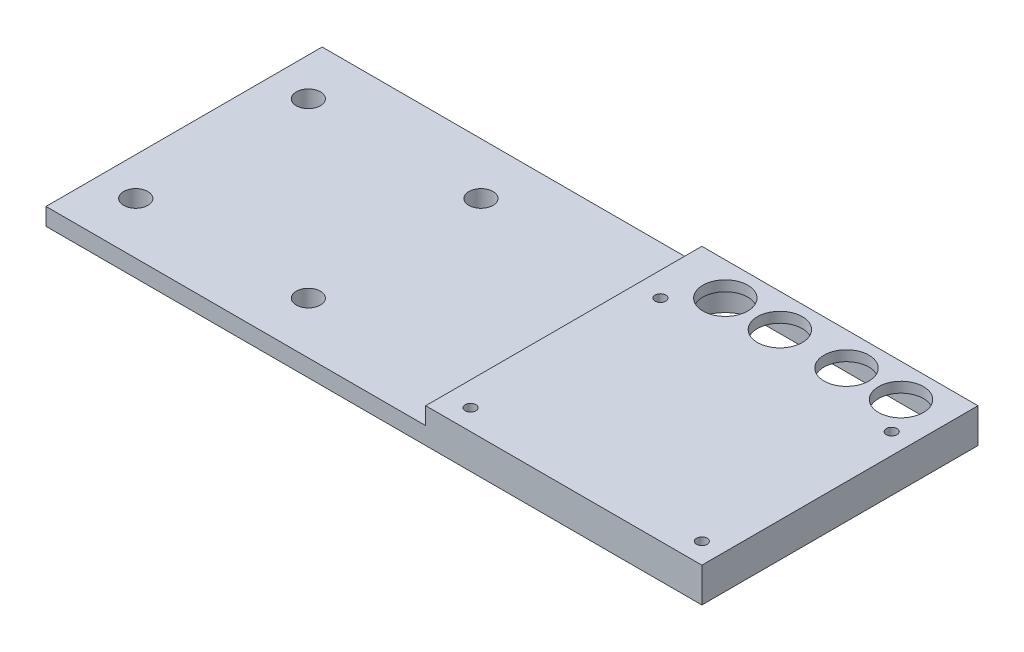
ISO-10303-21;
HEADER;
FILE_DESCRIPTION(('STEP AP214'),'2;1');
FILE_NAME('part.step','',(''),(''),'','','');
FILE_SCHEMA(('AUTOMOTIVE_DESIGN { 1 0 10303 214 1 1 1 1 }'));
ENDSEC;
DATA;
#1=APPLICATION_CONTEXT('core data for automotive mechanical design processes');
#2=APPLICATION_PROTOCOL_DEFINITION('international standard','automotive_design',2000,#1);
#3=PRODUCT_CONTEXT('',#1,'mechanical');
#4=PRODUCT('Part','Part','',(#3));
#5=PRODUCT_RELATED_PRODUCT_CATEGORY('part','',(#4));
#6=PRODUCT_DEFINITION_FORMATION('','',#4);
#7=PRODUCT_DEFINITION_CONTEXT('part definition',#1,'design');
#8=PRODUCT_DEFINITION('design','',#6,#7);
#9=PRODUCT_DEFINITION_SHAPE('','',#8);
#10=(LENGTH_UNIT() NAMED_UNIT(*) SI_UNIT(.MILLI.,.METRE.));
#11=(NAMED_UNIT(*) PLANE_ANGLE_UNIT() SI_UNIT($,.RADIAN.));
#12=(NAMED_UNIT(*) SI_UNIT($,.STERADIAN.) SOLID_ANGLE_UNIT());
#13=UNCERTAINTY_MEASURE_WITH_UNIT(LENGTH_MEASURE(1.E-05),#10,'distance_accuracy_value','');
#14=(GEOMETRIC_REPRESENTATION_CONTEXT(3) GLOBAL_UNCERTAINTY_ASSIGNED_CONTEXT((#13)) GLOBAL_UNIT_ASSIGNED_CONTEXT((#10,
#11,#12)) REPRESENTATION_CONTEXT('',''));
#15=CARTESIAN_POINT('',(0.,0.,0.));
#16=DIRECTION('',(0.,0.,1.));
#17=DIRECTION('',(1.,0.,0.));
#18=AXIS2_PLACEMENT_3D('',#15,#16,#17);
#19=CARTESIAN_POINT('',(82.3,10.,-30.4));
#20=DIRECTION('',(0.,-1.,0.));
#21=DIRECTION('',(0.,0.,-1.));
#22=AXIS2_PLACEMENT_3D('',#19,#20,#21);
#23=CYLINDRICAL_SURFACE('',#22,6.5);
#24=CARTESIAN_POINT('',(82.3,10.,-30.4));
#25=DIRECTION('',(0.,-1.,0.));
#26=DIRECTION('',(0.,0.,-1.));
#27=AXIS2_PLACEMENT_3D('',#24,#25,#26);
#28=CIRCLE('',#27,6.5);
#29=CARTESIAN_POINT('',(82.3,10.,-36.9));
#30=VERTEX_POINT('',#29);
#31=EDGE_CURVE('E174',#30,#30,#28,.T.);
#32=ORIENTED_EDGE('',*,*,#31,.F.);
#33=EDGE_LOOP('',(#32));
#34=FACE_BOUND('',#33,.T.);
#35=CARTESIAN_POINT('',(82.3,7.,-30.4));
#36=DIRECTION('',(0.,-1.,0.));
#37=DIRECTION('',(0.,0.,-1.));
#38=AXIS2_PLACEMENT_3D('',#35,#36,#37);
#39=CIRCLE('',#38,6.5);
#40=CARTESIAN_POINT('',(82.3,7.,-36.9));
#41=VERTEX_POINT('',#40);
#42=EDGE_CURVE('E170',#41,#41,#39,.F.);
#43=ORIENTED_EDGE('',*,*,#42,.F.);
#44=EDGE_LOOP('',(#43));
#45=FACE_BOUND('',#44,.T.);
#46=ADVANCED_FACE('F40',(#34,#45),#23,.F.);
#47=CARTESIAN_POINT('',(66.4999999999999,10.,-30.4));
#48=DIRECTION('',(0.,-1.,0.));
#49=DIRECTION('',(0.,0.,-1.));
#50=AXIS2_PLACEMENT_3D('',#47,#48,#49);
#51=CYLINDRICAL_SURFACE('',#50,6.5);
#52=CARTESIAN_POINT('',(66.4999999999999,10.,-30.4));
#53=DIRECTION('',(0.,-1.,0.));
#54=DIRECTION('',(0.,0.,-1.));
#55=AXIS2_PLACEMENT_3D('',#52,#53,#54);
#56=CIRCLE('',#55,6.5);
#57=CARTESIAN_POINT('',(66.4999999999999,10.,-36.9));
#58=VERTEX_POINT('',#57);
#59=EDGE_CURVE('E184',#58,#58,#56,.T.);
#60=ORIENTED_EDGE('',*,*,#59,.F.);
#61=EDGE_LOOP('',(#60));
#62=FACE_BOUND('',#61,.T.);
#63=CARTESIAN_POINT('',(66.4999999999999,7.,-30.4));
#64=DIRECTION('',(0.,-1.,0.));
#65=DIRECTION('',(0.,0.,-1.));
#66=AXIS2_PLACEMENT_3D('',#63,#64,#65);
#67=CIRCLE('',#66,6.5);
#68=CARTESIAN_POINT('',(66.4999999999999,7.,-36.9));
#69=VERTEX_POINT('',#68);
#70=EDGE_CURVE('E166',#69,#69,#67,.F.);
#71=ORIENTED_EDGE('',*,*,#70,.F.);
#72=EDGE_LOOP('',(#71));
#73=FACE_BOUND('',#72,.T.);
#74=ADVANCED_FACE('F319',(#62,#73),#51,.F.);
#75=CARTESIAN_POINT('',(47.2,10.,-30.4));
#76=DIRECTION('',(0.,-1.,0.));
#77=DIRECTION('',(0.,0.,-1.));
#78=AXIS2_PLACEMENT_3D('',#75,#76,#77);
#79=CYLINDRICAL_SURFACE('',#78,6.5);
#80=CARTESIAN_POINT('',(47.2,10.,-30.4));
#81=DIRECTION('',(0.,-1.,0.));
#82=DIRECTION('',(0.,0.,-1.));
#83=AXIS2_PLACEMENT_3D('',#80,#81,#82);
#84=CIRCLE('',#83,6.5);
#85=CARTESIAN_POINT('',(47.2,10.,-36.9));
#86=VERTEX_POINT('',#85);
#87=EDGE_CURVE('E180',#86,#86,#84,.T.);
#88=ORIENTED_EDGE('',*,*,#87,.F.);
#89=EDGE_LOOP('',(#88));
#90=FACE_BOUND('',#89,.T.);
#91=CARTESIAN_POINT('',(47.2,7.,-30.4));
#92=DIRECTION('',(0.,-1.,0.));
#93=DIRECTION('',(0.,0.,-1.));
#94=AXIS2_PLACEMENT_3D('',#91,#92,#93);
#95=CIRCLE('',#94,6.5);
#96=CARTESIAN_POINT('',(47.2,7.,-36.9));
#97=VERTEX_POINT('',#96);
#98=EDGE_CURVE('E162',#97,#97,#95,.F.);
#99=ORIENTED_EDGE('',*,*,#98,.F.);
#100=EDGE_LOOP('',(#99));
#101=FACE_BOUND('',#100,.T.);
#102=ADVANCED_FACE('F326',(#90,#101),#79,.F.);
#103=CARTESIAN_POINT('',(31.3999999999999,10.,-30.4));
#104=DIRECTION('',(0.,-1.,0.));
#105=DIRECTION('',(0.,0.,-1.));
#106=AXIS2_PLACEMENT_3D('',#103,#104,#105);
#107=CYLINDRICAL_SURFACE('',#106,6.5);
#108=CARTESIAN_POINT('',(31.3999999999999,10.,-30.4));
#109=DIRECTION('',(0.,-1.,0.));
#110=DIRECTION('',(0.,0.,-1.));
#111=AXIS2_PLACEMENT_3D('',#108,#109,#110);
#112=CIRCLE('',#111,6.5);
#113=CARTESIAN_POINT('',(31.3999999999999,10.,-36.9));
#114=VERTEX_POINT('',#113);
#115=EDGE_CURVE('E175',#114,#114,#112,.T.);
#116=ORIENTED_EDGE('',*,*,#115,.F.);
#117=EDGE_LOOP('',(#116));
#118=FACE_BOUND('',#117,.T.);
#119=CARTESIAN_POINT('',(31.3999999999999,7.,-30.4));
#120=DIRECTION('',(0.,-1.,0.));
#121=DIRECTION('',(0.,0.,-1.));
#122=AXIS2_PLACEMENT_3D('',#119,#120,#121);
#123=CIRCLE('',#122,6.5);
#124=CARTESIAN_POINT('',(31.3999999999999,7.,-36.9));
#125=VERTEX_POINT('',#124);
#126=EDGE_CURVE('E44',#125,#125,#123,.F.);
#127=ORIENTED_EDGE('',*,*,#126,.F.);
#128=EDGE_LOOP('',(#127));
#129=FACE_BOUND('',#128,.T.);
#130=ADVANCED_FACE('F383',(#118,#129),#107,.F.);
#131=CARTESIAN_POINT('',(95.,5.,-40.));
#132=DIRECTION('',(-1.,0.,0.));
#133=DIRECTION('',(0.,0.,1.));
#134=AXIS2_PLACEMENT_3D('',#131,#132,#133);
#135=PLANE('',#134);
#136=DIRECTION('',(0.,0.,-1.));
#137=VECTOR('',#136,1.);
#138=CARTESIAN_POINT('',(95.,0.,-40.));
#139=LINE('',#138,#137);
#140=CARTESIAN_POINT('',(95.,0.,40.));
#141=VERTEX_POINT('',#140);
#142=CARTESIAN_POINT('',(95.,0.,-40.));
#143=VERTEX_POINT('',#142);
#144=EDGE_CURVE('E246',#141,#143,#139,.T.);
#145=ORIENTED_EDGE('',*,*,#144,.T.);
#146=DIRECTION('',(0.,-1.,0.));
#147=VECTOR('',#146,1.);
#148=CARTESIAN_POINT('',(95.,5.,-40.));
#149=LINE('',#148,#147);
#150=CARTESIAN_POINT('',(95.,10.,-40.));
#151=VERTEX_POINT('',#150);
#152=EDGE_CURVE('E12',#151,#143,#149,.T.);
#153=ORIENTED_EDGE('',*,*,#152,.F.);
#154=DIRECTION('',(0.,0.,-1.));
#155=VECTOR('',#154,1.);
#156=CARTESIAN_POINT('',(95.,10.,-40.));
#157=LINE('',#156,#155);
#158=CARTESIAN_POINT('',(95.,10.,40.));
#159=VERTEX_POINT('',#158);
#160=EDGE_CURVE('E222',#159,#151,#157,.T.);
#161=ORIENTED_EDGE('',*,*,#160,.F.);
#162=DIRECTION('',(0.,-1.,0.));
#163=VECTOR('',#162,1.);
#164=CARTESIAN_POINT('',(95.,5.,40.));
#165=LINE('',#164,#163);
#166=EDGE_CURVE('E257',#159,#141,#165,.T.);
#167=ORIENTED_EDGE('',*,*,#166,.T.);
#168=EDGE_LOOP('',(#145,#153,#161,#167));
#169=FACE_BOUND('',#168,.T.);
#170=ADVANCED_FACE('F42',(#169),#135,.F.);
#171=CARTESIAN_POINT('',(-95.,5.,-40.));
#172=DIRECTION('',(0.,0.,1.));
#173=DIRECTION('',(1.,0.,0.));
#174=AXIS2_PLACEMENT_3D('',#171,#172,#173);
#175=PLANE('',#174);
#176=DIRECTION('',(-1.,0.,0.));
#177=VECTOR('',#176,1.);
#178=CARTESIAN_POINT('',(-95.,0.,-40.));
#179=LINE('',#178,#177);
#180=CARTESIAN_POINT('',(-95.,0.,-40.));
#181=VERTEX_POINT('',#180);
#182=EDGE_CURVE('E261',#143,#181,#179,.T.);
#183=ORIENTED_EDGE('',*,*,#182,.T.);
#184=DIRECTION('',(0.,-1.,0.));
#185=VECTOR('',#184,1.);
#186=CARTESIAN_POINT('',(-95.,5.,-40.));
#187=LINE('',#186,#185);
#188=CARTESIAN_POINT('',(-95.,5.,-40.));
#189=VERTEX_POINT('',#188);
#190=EDGE_CURVE('E50',#189,#181,#187,.T.);
#191=ORIENTED_EDGE('',*,*,#190,.F.);
#192=DIRECTION('',(-1.,0.,0.));
#193=VECTOR('',#192,1.);
#194=CARTESIAN_POINT('',(-95.,5.,-40.));
#195=LINE('',#194,#193);
#196=CARTESIAN_POINT('',(15.,5.,-40.));
#197=VERTEX_POINT('',#196);
#198=EDGE_CURVE('E247',#197,#189,#195,.T.);
#199=ORIENTED_EDGE('',*,*,#198,.F.);
#200=DIRECTION('',(0.,-1.,0.));
#201=VECTOR('',#200,1.);
#202=CARTESIAN_POINT('',(15.,10.,-40.));
#203=LINE('',#202,#201);
#204=CARTESIAN_POINT('',(15.,10.,-40.));
#205=VERTEX_POINT('',#204);
#206=EDGE_CURVE('E242',#205,#197,#203,.T.);
#207=ORIENTED_EDGE('',*,*,#206,.F.);
#208=DIRECTION('',(-1.,0.,0.));
#209=VECTOR('',#208,1.);
#210=CARTESIAN_POINT('',(95.,10.,-40.));
#211=LINE('',#210,#209);
#212=EDGE_CURVE('E226',#151,#205,#211,.T.);
#213=ORIENTED_EDGE('',*,*,#212,.F.);
#214=ORIENTED_EDGE('',*,*,#152,.T.);
#215=EDGE_LOOP('',(#183,#191,#199,#207,#213,#214));
#216=FACE_BOUND('',#215,.T.);
#217=ADVANCED_FACE('F302',(#216),#175,.F.);
#218=CARTESIAN_POINT('',(-95.,5.,-40.));
#219=DIRECTION('',(1.,0.,0.));
#220=DIRECTION('',(0.,0.,-1.));
#221=AXIS2_PLACEMENT_3D('',#218,#219,#220);
#222=PLANE('',#221);
#223=DIRECTION('',(0.,0.,1.));
#224=VECTOR('',#223,1.);
#225=CARTESIAN_POINT('',(-95.,0.,-40.));
#226=LINE('',#225,#224);
#227=CARTESIAN_POINT('',(-95.,0.,40.));
#228=VERTEX_POINT('',#227);
#229=EDGE_CURVE('E264',#181,#228,#226,.T.);
#230=ORIENTED_EDGE('',*,*,#229,.T.);
#231=DIRECTION('',(0.,-1.,0.));
#232=VECTOR('',#231,1.);
#233=CARTESIAN_POINT('',(-95.,5.,40.));
#234=LINE('',#233,#232);
#235=CARTESIAN_POINT('',(-95.,5.,40.));
#236=VERTEX_POINT('',#235);
#237=EDGE_CURVE('E272',#236,#228,#234,.T.);
#238=ORIENTED_EDGE('',*,*,#237,.F.);
#239=DIRECTION('',(0.,0.,1.));
#240=VECTOR('',#239,1.);
#241=CARTESIAN_POINT('',(-95.,5.,-40.));
#242=LINE('',#241,#240);
#243=EDGE_CURVE('E250',#189,#236,#242,.T.);
#244=ORIENTED_EDGE('',*,*,#243,.F.);
#245=ORIENTED_EDGE('',*,*,#190,.T.);
#246=EDGE_LOOP('',(#230,#238,#244,#245));
#247=FACE_BOUND('',#246,.T.);
#248=ADVANCED_FACE('F282',(#247),#222,.F.);
#249=CARTESIAN_POINT('',(-95.,5.,40.));
#250=DIRECTION('',(0.,0.,-1.));
#251=DIRECTION('',(-1.,0.,0.));
#252=AXIS2_PLACEMENT_3D('',#249,#250,#251);
#253=PLANE('',#252);
#254=DIRECTION('',(1.,0.,0.));
#255=VECTOR('',#254,1.);
#256=CARTESIAN_POINT('',(-95.,0.,40.));
#257=LINE('',#256,#255);
#258=EDGE_CURVE('E251',#228,#141,#257,.T.);
#259=ORIENTED_EDGE('',*,*,#258,.T.);
#260=ORIENTED_EDGE('',*,*,#166,.F.);
#261=DIRECTION('',(1.,0.,0.));
#262=VECTOR('',#261,1.);
#263=CARTESIAN_POINT('',(95.,10.,40.));
#264=LINE('',#263,#262);
#265=CARTESIAN_POINT('',(15.,10.,40.));
#266=VERTEX_POINT('',#265);
#267=EDGE_CURVE('E232',#266,#159,#264,.T.);
#268=ORIENTED_EDGE('',*,*,#267,.F.);
#269=DIRECTION('',(0.,-1.,0.));
#270=VECTOR('',#269,1.);
#271=CARTESIAN_POINT('',(15.,10.,40.));
#272=LINE('',#271,#270);
#273=CARTESIAN_POINT('',(15.,5.,40.));
#274=VERTEX_POINT('',#273);
#275=EDGE_CURVE('E236',#266,#274,#272,.T.);
#276=ORIENTED_EDGE('',*,*,#275,.T.);
#277=DIRECTION('',(1.,0.,0.));
#278=VECTOR('',#277,1.);
#279=CARTESIAN_POINT('',(-95.,5.,40.));
#280=LINE('',#279,#278);
#281=EDGE_CURVE('E254',#236,#274,#280,.T.);
#282=ORIENTED_EDGE('',*,*,#281,.F.);
#283=ORIENTED_EDGE('',*,*,#237,.T.);
#284=EDGE_LOOP('',(#259,#260,#268,#276,#282,#283));
#285=FACE_BOUND('',#284,.T.);
#286=ADVANCED_FACE('F289',(#285),#253,.F.);
#287=CARTESIAN_POINT('',(0.,5.,0.));
#288=DIRECTION('',(0.,1.,0.));
#289=DIRECTION('',(0.,0.,1.));
#290=AXIS2_PLACEMENT_3D('',#287,#288,#289);
#291=PLANE('',#290);
#292=CARTESIAN_POINT('',(-34.0000000000001,5.,25.));
#293=DIRECTION('',(0.,1.,0.));
#294=DIRECTION('',(0.,0.,1.));
#295=AXIS2_PLACEMENT_3D('',#292,#293,#294);
#296=CIRCLE('',#295,3.5);
#297=CARTESIAN_POINT('',(-34.0000000000001,5.,28.5));
#298=VERTEX_POINT('',#297);
#299=EDGE_CURVE('E492',#298,#298,#296,.T.);
#300=ORIENTED_EDGE('',*,*,#299,.F.);
#301=EDGE_LOOP('',(#300));
#302=FACE_BOUND('',#301,.T.);
#303=CARTESIAN_POINT('',(-84.0000000000001,5.,-25.));
#304=DIRECTION('',(0.,1.,0.));
#305=DIRECTION('',(0.,0.,1.));
#306=AXIS2_PLACEMENT_3D('',#303,#304,#305);
#307=CIRCLE('',#306,3.50000000000001);
#308=CARTESIAN_POINT('',(-84.0000000000001,5.,-21.5));
#309=VERTEX_POINT('',#308);
#310=EDGE_CURVE('E517',#309,#309,#307,.T.);
#311=ORIENTED_EDGE('',*,*,#310,.F.);
#312=EDGE_LOOP('',(#311));
#313=FACE_BOUND('',#312,.T.);
#314=CARTESIAN_POINT('',(-34.,5.,-25.));
#315=DIRECTION('',(0.,1.,0.));
#316=DIRECTION('',(0.,0.,1.));
#317=AXIS2_PLACEMENT_3D('',#314,#315,#316);
#318=CIRCLE('',#317,3.5);
#319=CARTESIAN_POINT('',(-34.,5.,-21.5));
#320=VERTEX_POINT('',#319);
#321=EDGE_CURVE('E513',#320,#320,#318,.T.);
#322=ORIENTED_EDGE('',*,*,#321,.F.);
#323=EDGE_LOOP('',(#322));
#324=FACE_BOUND('',#323,.T.);
#325=CARTESIAN_POINT('',(-84.0000000000001,5.,25.));
#326=DIRECTION('',(0.,1.,0.));
#327=DIRECTION('',(0.,0.,1.));
#328=AXIS2_PLACEMENT_3D('',#325,#326,#327);
#329=CIRCLE('',#328,3.50000000000001);
#330=CARTESIAN_POINT('',(-84.0000000000001,5.,28.5));
#331=VERTEX_POINT('',#330);
#332=EDGE_CURVE('E503',#331,#331,#329,.T.);
#333=ORIENTED_EDGE('',*,*,#332,.F.);
#334=EDGE_LOOP('',(#333));
#335=FACE_BOUND('',#334,.T.);
#336=DIRECTION('',(0.,0.,1.));
#337=VECTOR('',#336,1.);
#338=CARTESIAN_POINT('',(15.,5.,-40.));
#339=LINE('',#338,#337);
#340=EDGE_CURVE('E65',#197,#274,#339,.T.);
#341=ORIENTED_EDGE('',*,*,#340,.F.);
#342=ORIENTED_EDGE('',*,*,#198,.T.);
#343=ORIENTED_EDGE('',*,*,#243,.T.);
#344=ORIENTED_EDGE('',*,*,#281,.T.);
#345=EDGE_LOOP('',(#341,#342,#343,#344));
#346=FACE_BOUND('',#345,.T.);
#347=ADVANCED_FACE('F303',(#302,#313,#324,#335,#346),#291,.T.);
#348=CARTESIAN_POINT('',(0.,0.,0.));
#349=DIRECTION('',(0.,1.,0.));
#350=DIRECTION('',(0.,0.,1.));
#351=AXIS2_PLACEMENT_3D('',#348,#349,#350);
#352=PLANE('',#351);
#353=CARTESIAN_POINT('',(-34.0000000000001,0.,25.));
#354=DIRECTION('',(0.,-1.,0.));
#355=DIRECTION('',(0.,0.,-1.));
#356=AXIS2_PLACEMENT_3D('',#353,#354,#355);
#357=CIRCLE('',#356,3.5);
#358=CARTESIAN_POINT('',(-34.0000000000001,0.,21.5));
#359=VERTEX_POINT('',#358);
#360=EDGE_CURVE('E495',#359,#359,#357,.T.);
#361=ORIENTED_EDGE('',*,*,#360,.F.);
#362=EDGE_LOOP('',(#361));
#363=FACE_BOUND('',#362,.T.);
#364=CARTESIAN_POINT('',(-84.0000000000001,0.,-25.));
#365=DIRECTION('',(0.,-1.,0.));
#366=DIRECTION('',(0.,0.,-1.));
#367=AXIS2_PLACEMENT_3D('',#364,#365,#366);
#368=CIRCLE('',#367,3.50000000000001);
#369=CARTESIAN_POINT('',(-84.0000000000001,0.,-28.5));
#370=VERTEX_POINT('',#369);
#371=EDGE_CURVE('E498',#370,#370,#368,.T.);
#372=ORIENTED_EDGE('',*,*,#371,.F.);
#373=EDGE_LOOP('',(#372));
#374=FACE_BOUND('',#373,.T.);
#375=CARTESIAN_POINT('',(-34.,0.,-25.));
#376=DIRECTION('',(0.,-1.,0.));
#377=DIRECTION('',(0.,0.,-1.));
#378=AXIS2_PLACEMENT_3D('',#375,#376,#377);
#379=CIRCLE('',#378,3.5);
#380=CARTESIAN_POINT('',(-34.,0.,-28.5));
#381=VERTEX_POINT('',#380);
#382=EDGE_CURVE('E506',#381,#381,#379,.T.);
#383=ORIENTED_EDGE('',*,*,#382,.F.);
#384=EDGE_LOOP('',(#383));
#385=FACE_BOUND('',#384,.T.);
#386=CARTESIAN_POINT('',(-84.0000000000001,0.,25.));
#387=DIRECTION('',(0.,-1.,0.));
#388=DIRECTION('',(0.,0.,-1.));
#389=AXIS2_PLACEMENT_3D('',#386,#387,#388);
#390=CIRCLE('',#389,3.50000000000001);
#391=CARTESIAN_POINT('',(-84.0000000000001,0.,21.5));
#392=VERTEX_POINT('',#391);
#393=EDGE_CURVE('E497',#392,#392,#390,.T.);
#394=ORIENTED_EDGE('',*,*,#393,.F.);
#395=EDGE_LOOP('',(#394));
#396=FACE_BOUND('',#395,.T.);
#397=DIRECTION('',(1.,0.,0.));
#398=VECTOR('',#397,1.);
#399=CARTESIAN_POINT('',(82.3,0.,-39.4));
#400=LINE('',#399,#398);
#401=CARTESIAN_POINT('',(31.3999999999999,0.,-39.4));
#402=VERTEX_POINT('',#401);
#403=CARTESIAN_POINT('',(82.3,0.,-39.4));
#404=VERTEX_POINT('',#403);
#405=EDGE_CURVE('E136',#402,#404,#400,.T.);
#406=ORIENTED_EDGE('',*,*,#405,.F.);
#407=CARTESIAN_POINT('',(31.3999999999999,0.,-30.4));
#408=DIRECTION('',(0.,-1.,0.));
#409=DIRECTION('',(0.,0.,1.));
#410=AXIS2_PLACEMENT_3D('',#407,#408,#409);
#411=CIRCLE('',#410,9.);
#412=CARTESIAN_POINT('',(31.3999999999999,0.,-21.4));
#413=VERTEX_POINT('',#412);
#414=EDGE_CURVE('E57',#413,#402,#411,.T.);
#415=ORIENTED_EDGE('',*,*,#414,.F.);
#416=DIRECTION('',(-1.,0.,0.));
#417=VECTOR('',#416,1.);
#418=CARTESIAN_POINT('',(31.3999999999999,0.,-21.4));
#419=LINE('',#418,#417);
#420=CARTESIAN_POINT('',(82.3,0.,-21.4));
#421=VERTEX_POINT('',#420);
#422=EDGE_CURVE('E144',#421,#413,#419,.T.);
#423=ORIENTED_EDGE('',*,*,#422,.F.);
#424=CARTESIAN_POINT('',(82.3,0.,-30.4));
#425=DIRECTION('',(0.,-1.,0.));
#426=DIRECTION('',(0.,0.,1.));
#427=AXIS2_PLACEMENT_3D('',#424,#425,#426);
#428=CIRCLE('',#427,9.);
#429=EDGE_CURVE('E125',#404,#421,#428,.T.);
#430=ORIENTED_EDGE('',*,*,#429,.F.);
#431=EDGE_LOOP('',(#406,#415,#423,#430));
#432=FACE_BOUND('',#431,.T.);
#433=CARTESIAN_POINT('',(89.,0.,-21.));
#434=DIRECTION('',(0.,1.,0.));
#435=DIRECTION('',(0.,0.,1.));
#436=AXIS2_PLACEMENT_3D('',#433,#434,#435);
#437=CIRCLE('',#436,1.54999999999999);
#438=CARTESIAN_POINT('',(89.,0.,-19.45));
#439=VERTEX_POINT('',#438);
#440=EDGE_CURVE('E199',#439,#439,#437,.T.);
#441=ORIENTED_EDGE('',*,*,#440,.T.);
#442=EDGE_LOOP('',(#441));
#443=FACE_BOUND('',#442,.T.);
#444=CARTESIAN_POINT('',(22.,0.,34.));
#445=DIRECTION('',(0.,1.,0.));
#446=DIRECTION('',(0.,0.,1.));
#447=AXIS2_PLACEMENT_3D('',#444,#445,#446);
#448=CIRCLE('',#447,1.55);
#449=CARTESIAN_POINT('',(22.,0.,35.55));
#450=VERTEX_POINT('',#449);
#451=EDGE_CURVE('E208',#450,#450,#448,.T.);
#452=ORIENTED_EDGE('',*,*,#451,.T.);
#453=EDGE_LOOP('',(#452));
#454=FACE_BOUND('',#453,.T.);
#455=CARTESIAN_POINT('',(89.,0.,34.));
#456=DIRECTION('',(0.,1.,0.));
#457=DIRECTION('',(0.,0.,1.));
#458=AXIS2_PLACEMENT_3D('',#455,#456,#457);
#459=CIRCLE('',#458,1.54999999999999);
#460=CARTESIAN_POINT('',(89.,0.,35.55));
#461=VERTEX_POINT('',#460);
#462=EDGE_CURVE('E191',#461,#461,#459,.T.);
#463=ORIENTED_EDGE('',*,*,#462,.T.);
#464=EDGE_LOOP('',(#463));
#465=FACE_BOUND('',#464,.T.);
#466=CARTESIAN_POINT('',(21.9999999999999,0.,-21.));
#467=DIRECTION('',(0.,1.,0.));
#468=DIRECTION('',(0.,0.,1.));
#469=AXIS2_PLACEMENT_3D('',#466,#467,#468);
#470=CIRCLE('',#469,1.55);
#471=CARTESIAN_POINT('',(21.9999999999999,0.,-19.45));
#472=VERTEX_POINT('',#471);
#473=EDGE_CURVE('E215',#472,#472,#470,.T.);
#474=ORIENTED_EDGE('',*,*,#473,.T.);
#475=EDGE_LOOP('',(#474));
#476=FACE_BOUND('',#475,.T.);
#477=ORIENTED_EDGE('',*,*,#144,.F.);
#478=ORIENTED_EDGE('',*,*,#258,.F.);
#479=ORIENTED_EDGE('',*,*,#229,.F.);
#480=ORIENTED_EDGE('',*,*,#182,.F.);
#481=EDGE_LOOP('',(#477,#478,#479,#480));
#482=FACE_BOUND('',#481,.T.);
#483=ADVANCED_FACE('F141',(#363,#374,#385,#396,#432,#443,#454,#465,#476,#482),#352,.F.);
#484=CARTESIAN_POINT('',(15.,10.,-40.));
#485=DIRECTION('',(1.,0.,0.));
#486=DIRECTION('',(0.,0.,-1.));
#487=AXIS2_PLACEMENT_3D('',#484,#485,#486);
#488=PLANE('',#487);
#489=ORIENTED_EDGE('',*,*,#340,.T.);
#490=ORIENTED_EDGE('',*,*,#275,.F.);
#491=DIRECTION('',(0.,0.,1.));
#492=VECTOR('',#491,1.);
#493=CARTESIAN_POINT('',(15.,10.,-40.));
#494=LINE('',#493,#492);
#495=EDGE_CURVE('E229',#205,#266,#494,.T.);
#496=ORIENTED_EDGE('',*,*,#495,.F.);
#497=ORIENTED_EDGE('',*,*,#206,.T.);
#498=EDGE_LOOP('',(#489,#490,#496,#497));
#499=FACE_BOUND('',#498,.T.);
#500=ADVANCED_FACE('F301',(#499),#488,.F.);
#501=CARTESIAN_POINT('',(0.,10.,0.));
#502=DIRECTION('',(0.,-1.,0.));
#503=DIRECTION('',(0.,0.,-1.));
#504=AXIS2_PLACEMENT_3D('',#501,#502,#503);
#505=PLANE('',#504);
#506=ORIENTED_EDGE('',*,*,#115,.T.);
#507=EDGE_LOOP('',(#506));
#508=FACE_BOUND('',#507,.T.);
#509=ORIENTED_EDGE('',*,*,#87,.T.);
#510=EDGE_LOOP('',(#509));
#511=FACE_BOUND('',#510,.T.);
#512=ORIENTED_EDGE('',*,*,#59,.T.);
#513=EDGE_LOOP('',(#512));
#514=FACE_BOUND('',#513,.T.);
#515=ORIENTED_EDGE('',*,*,#31,.T.);
#516=EDGE_LOOP('',(#515));
#517=FACE_BOUND('',#516,.T.);
#518=CARTESIAN_POINT('',(89.,10.,-21.));
#519=DIRECTION('',(0.,1.,0.));
#520=DIRECTION('',(0.,0.,1.));
#521=AXIS2_PLACEMENT_3D('',#518,#519,#520);
#522=CIRCLE('',#521,1.54999999999999);
#523=CARTESIAN_POINT('',(89.,10.,-19.45));
#524=VERTEX_POINT('',#523);
#525=EDGE_CURVE('E204',#524,#524,#522,.T.);
#526=ORIENTED_EDGE('',*,*,#525,.F.);
#527=EDGE_LOOP('',(#526));
#528=FACE_BOUND('',#527,.T.);
#529=CARTESIAN_POINT('',(22.,10.,34.));
#530=DIRECTION('',(0.,1.,0.));
#531=DIRECTION('',(0.,0.,1.));
#532=AXIS2_PLACEMENT_3D('',#529,#530,#531);
#533=CIRCLE('',#532,1.55);
#534=CARTESIAN_POINT('',(22.,10.,35.55));
#535=VERTEX_POINT('',#534);
#536=EDGE_CURVE('E195',#535,#535,#533,.T.);
#537=ORIENTED_EDGE('',*,*,#536,.F.);
#538=EDGE_LOOP('',(#537));
#539=FACE_BOUND('',#538,.T.);
#540=CARTESIAN_POINT('',(89.,10.,34.));
#541=DIRECTION('',(0.,1.,0.));
#542=DIRECTION('',(0.,0.,1.));
#543=AXIS2_PLACEMENT_3D('',#540,#541,#542);
#544=CIRCLE('',#543,1.54999999999999);
#545=CARTESIAN_POINT('',(89.,10.,35.55));
#546=VERTEX_POINT('',#545);
#547=EDGE_CURVE('E179',#546,#546,#544,.T.);
#548=ORIENTED_EDGE('',*,*,#547,.F.);
#549=EDGE_LOOP('',(#548));
#550=FACE_BOUND('',#549,.T.);
#551=CARTESIAN_POINT('',(21.9999999999999,10.,-21.));
#552=DIRECTION('',(0.,1.,0.));
#553=DIRECTION('',(0.,0.,1.));
#554=AXIS2_PLACEMENT_3D('',#551,#552,#553);
#555=CIRCLE('',#554,1.55);
#556=CARTESIAN_POINT('',(21.9999999999999,10.,-19.45));
#557=VERTEX_POINT('',#556);
#558=EDGE_CURVE('E203',#557,#557,#555,.T.);
#559=ORIENTED_EDGE('',*,*,#558,.F.);
#560=EDGE_LOOP('',(#559));
#561=FACE_BOUND('',#560,.T.);
#562=ORIENTED_EDGE('',*,*,#160,.T.);
#563=ORIENTED_EDGE('',*,*,#212,.T.);
#564=ORIENTED_EDGE('',*,*,#495,.T.);
#565=ORIENTED_EDGE('',*,*,#267,.T.);
#566=EDGE_LOOP('',(#562,#563,#564,#565));
#567=FACE_BOUND('',#566,.T.);
#568=ADVANCED_FACE('F296',(#508,#511,#514,#517,#528,#539,#550,#561,#567),#505,.F.);
#569=CARTESIAN_POINT('',(21.9999999999999,0.,-21.));
#570=DIRECTION('',(0.,1.,0.));
#571=DIRECTION('',(0.,0.,1.));
#572=AXIS2_PLACEMENT_3D('',#569,#570,#571);
#573=CYLINDRICAL_SURFACE('',#572,1.55);
#574=ORIENTED_EDGE('',*,*,#473,.F.);
#575=EDGE_LOOP('',(#574));
#576=FACE_BOUND('',#575,.T.);
#577=ORIENTED_EDGE('',*,*,#558,.T.);
#578=EDGE_LOOP('',(#577));
#579=FACE_BOUND('',#578,.T.);
#580=ADVANCED_FACE('F337',(#576,#579),#573,.F.);
#581=CARTESIAN_POINT('',(89.,0.,34.));
#582=DIRECTION('',(0.,1.,0.));
#583=DIRECTION('',(0.,0.,1.));
#584=AXIS2_PLACEMENT_3D('',#581,#582,#583);
#585=CYLINDRICAL_SURFACE('',#584,1.54999999999999);
#586=ORIENTED_EDGE('',*,*,#462,.F.);
#587=EDGE_LOOP('',(#586));
#588=FACE_BOUND('',#587,.T.);
#589=ORIENTED_EDGE('',*,*,#547,.T.);
#590=EDGE_LOOP('',(#589));
#591=FACE_BOUND('',#590,.T.);
#592=ADVANCED_FACE('F333',(#588,#591),#585,.F.);
#593=CARTESIAN_POINT('',(22.,0.,34.));
#594=DIRECTION('',(0.,1.,0.));
#595=DIRECTION('',(0.,0.,1.));
#596=AXIS2_PLACEMENT_3D('',#593,#594,#595);
#597=CYLINDRICAL_SURFACE('',#596,1.55);
#598=ORIENTED_EDGE('',*,*,#451,.F.);
#599=EDGE_LOOP('',(#598));
#600=FACE_BOUND('',#599,.T.);
#601=ORIENTED_EDGE('',*,*,#536,.T.);
#602=EDGE_LOOP('',(#601));
#603=FACE_BOUND('',#602,.T.);
#604=ADVANCED_FACE('F336',(#600,#603),#597,.F.);
#605=CARTESIAN_POINT('',(89.,0.,-21.));
#606=DIRECTION('',(0.,1.,0.));
#607=DIRECTION('',(0.,0.,1.));
#608=AXIS2_PLACEMENT_3D('',#605,#606,#607);
#609=CYLINDRICAL_SURFACE('',#608,1.54999999999999);
#610=ORIENTED_EDGE('',*,*,#440,.F.);
#611=EDGE_LOOP('',(#610));
#612=FACE_BOUND('',#611,.T.);
#613=ORIENTED_EDGE('',*,*,#525,.T.);
#614=EDGE_LOOP('',(#613));
#615=FACE_BOUND('',#614,.T.);
#616=ADVANCED_FACE('F339',(#612,#615),#609,.F.);
#617=CARTESIAN_POINT('',(0.,7.,0.));
#618=DIRECTION('',(0.,-1.,0.));
#619=DIRECTION('',(0.,0.,-1.));
#620=AXIS2_PLACEMENT_3D('',#617,#618,#619);
#621=PLANE('',#620);
#622=CARTESIAN_POINT('',(31.3999999999999,7.00000000000001,-30.4));
#623=DIRECTION('',(0.,-1.,0.));
#624=DIRECTION('',(0.,0.,-1.));
#625=AXIS2_PLACEMENT_3D('',#622,#623,#624);
#626=CIRCLE('',#625,9.);
#627=CARTESIAN_POINT('',(31.3999999999999,7.00000000000001,-39.4));
#628=VERTEX_POINT('',#627);
#629=CARTESIAN_POINT('',(31.3999999999999,7.00000000000001,-21.4));
#630=VERTEX_POINT('',#629);
#631=EDGE_CURVE('E161',#628,#630,#626,.F.);
#632=ORIENTED_EDGE('',*,*,#631,.F.);
#633=DIRECTION('',(-1.,0.,0.));
#634=VECTOR('',#633,1.);
#635=CARTESIAN_POINT('',(82.3,7.00000000000001,-39.4));
#636=LINE('',#635,#634);
#637=CARTESIAN_POINT('',(82.3,7.00000000000001,-39.4));
#638=VERTEX_POINT('',#637);
#639=EDGE_CURVE('E158',#638,#628,#636,.T.);
#640=ORIENTED_EDGE('',*,*,#639,.F.);
#641=CARTESIAN_POINT('',(82.3,7.00000000000001,-30.4));
#642=DIRECTION('',(0.,-1.,0.));
#643=DIRECTION('',(0.,0.,-1.));
#644=AXIS2_PLACEMENT_3D('',#641,#642,#643);
#645=CIRCLE('',#644,9.);
#646=CARTESIAN_POINT('',(82.3,7.00000000000001,-21.4));
#647=VERTEX_POINT('',#646);
#648=EDGE_CURVE('E128',#647,#638,#645,.F.);
#649=ORIENTED_EDGE('',*,*,#648,.F.);
#650=DIRECTION('',(1.,0.,0.));
#651=VECTOR('',#650,1.);
#652=CARTESIAN_POINT('',(31.3999999999999,7.00000000000001,-21.4));
#653=LINE('',#652,#651);
#654=EDGE_CURVE('E525',#630,#647,#653,.T.);
#655=ORIENTED_EDGE('',*,*,#654,.F.);
#656=EDGE_LOOP('',(#632,#640,#649,#655));
#657=FACE_BOUND('',#656,.T.);
#658=ORIENTED_EDGE('',*,*,#126,.T.);
#659=EDGE_LOOP('',(#658));
#660=FACE_BOUND('',#659,.T.);
#661=ORIENTED_EDGE('',*,*,#98,.T.);
#662=EDGE_LOOP('',(#661));
#663=FACE_BOUND('',#662,.T.);
#664=ORIENTED_EDGE('',*,*,#70,.T.);
#665=EDGE_LOOP('',(#664));
#666=FACE_BOUND('',#665,.T.);
#667=ORIENTED_EDGE('',*,*,#42,.T.);
#668=EDGE_LOOP('',(#667));
#669=FACE_BOUND('',#668,.T.);
#670=ADVANCED_FACE('F342',(#657,#660,#663,#666,#669),#621,.T.);
#671=CARTESIAN_POINT('',(31.3999999999999,81.2124286905032,-30.4));
#672=DIRECTION('',(0.,-1.,0.));
#673=DIRECTION('',(0.,0.,-1.));
#674=AXIS2_PLACEMENT_3D('',#671,#672,#673);
#675=CYLINDRICAL_SURFACE('',#674,9.);
#676=ORIENTED_EDGE('',*,*,#631,.T.);
#677=DIRECTION('',(0.,-1.,0.));
#678=VECTOR('',#677,1.);
#679=CARTESIAN_POINT('',(31.3999999999999,81.2124286905032,-21.4));
#680=LINE('',#679,#678);
#681=EDGE_CURVE('E151',#630,#413,#680,.T.);
#682=ORIENTED_EDGE('',*,*,#681,.T.);
#683=ORIENTED_EDGE('',*,*,#414,.T.);
#684=DIRECTION('',(0.,-1.,0.));
#685=VECTOR('',#684,1.);
#686=CARTESIAN_POINT('',(31.3999999999999,81.2124286905032,-39.4));
#687=LINE('',#686,#685);
#688=EDGE_CURVE('E133',#628,#402,#687,.T.);
#689=ORIENTED_EDGE('',*,*,#688,.F.);
#690=EDGE_LOOP('',(#676,#682,#683,#689));
#691=FACE_BOUND('',#690,.T.);
#692=ADVANCED_FACE('F412',(#691),#675,.F.);
#693=CARTESIAN_POINT('',(31.3999999999999,81.2124286905032,-21.4));
#694=DIRECTION('',(0.,0.,1.));
#695=DIRECTION('',(1.,0.,0.));
#696=AXIS2_PLACEMENT_3D('',#693,#694,#695);
#697=PLANE('',#696);
#698=ORIENTED_EDGE('',*,*,#654,.T.);
#699=DIRECTION('',(0.,-1.,0.));
#700=VECTOR('',#699,1.);
#701=CARTESIAN_POINT('',(82.3,81.2124286905032,-21.4));
#702=LINE('',#701,#700);
#703=EDGE_CURVE('E132',#647,#421,#702,.T.);
#704=ORIENTED_EDGE('',*,*,#703,.T.);
#705=ORIENTED_EDGE('',*,*,#422,.T.);
#706=ORIENTED_EDGE('',*,*,#681,.F.);
#707=EDGE_LOOP('',(#698,#704,#705,#706));
#708=FACE_BOUND('',#707,.T.);
#709=ADVANCED_FACE('F419',(#708),#697,.F.);
#710=CARTESIAN_POINT('',(82.3,81.2124286905032,-30.4));
#711=DIRECTION('',(0.,-1.,0.));
#712=DIRECTION('',(0.,0.,-1.));
#713=AXIS2_PLACEMENT_3D('',#710,#711,#712);
#714=CYLINDRICAL_SURFACE('',#713,9.);
#715=ORIENTED_EDGE('',*,*,#648,.T.);
#716=DIRECTION('',(0.,-1.,0.));
#717=VECTOR('',#716,1.);
#718=CARTESIAN_POINT('',(82.3,81.2124286905032,-39.4));
#719=LINE('',#718,#717);
#720=EDGE_CURVE('E120',#638,#404,#719,.T.);
#721=ORIENTED_EDGE('',*,*,#720,.T.);
#722=ORIENTED_EDGE('',*,*,#429,.T.);
#723=ORIENTED_EDGE('',*,*,#703,.F.);
#724=EDGE_LOOP('',(#715,#721,#722,#723));
#725=FACE_BOUND('',#724,.T.);
#726=ADVANCED_FACE('F122',(#725),#714,.F.);
#727=CARTESIAN_POINT('',(82.3,81.2124286905032,-39.4));
#728=DIRECTION('',(0.,0.,-1.));
#729=DIRECTION('',(-1.,0.,0.));
#730=AXIS2_PLACEMENT_3D('',#727,#728,#729);
#731=PLANE('',#730);
#732=ORIENTED_EDGE('',*,*,#639,.T.);
#733=ORIENTED_EDGE('',*,*,#688,.T.);
#734=ORIENTED_EDGE('',*,*,#405,.T.);
#735=ORIENTED_EDGE('',*,*,#720,.F.);
#736=EDGE_LOOP('',(#732,#733,#734,#735));
#737=FACE_BOUND('',#736,.T.);
#738=ADVANCED_FACE('F137',(#737),#731,.F.);
#739=CARTESIAN_POINT('',(-84.0000000000001,10.,25.));
#740=DIRECTION('',(0.,-1.,0.));
#741=DIRECTION('',(0.,0.,-1.));
#742=AXIS2_PLACEMENT_3D('',#739,#740,#741);
#743=CYLINDRICAL_SURFACE('',#742,3.50000000000001);
#744=ORIENTED_EDGE('',*,*,#332,.T.);
#745=EDGE_LOOP('',(#744));
#746=FACE_BOUND('',#745,.T.);
#747=ORIENTED_EDGE('',*,*,#393,.T.);
#748=EDGE_LOOP('',(#747));
#749=FACE_BOUND('',#748,.T.);
#750=ADVANCED_FACE('F438',(#746,#749),#743,.F.);
#751=CARTESIAN_POINT('',(-34.,10.,-25.));
#752=DIRECTION('',(0.,-1.,0.));
#753=DIRECTION('',(0.,0.,-1.));
#754=AXIS2_PLACEMENT_3D('',#751,#752,#753);
#755=CYLINDRICAL_SURFACE('',#754,3.5);
#756=ORIENTED_EDGE('',*,*,#321,.T.);
#757=EDGE_LOOP('',(#756));
#758=FACE_BOUND('',#757,.T.);
#759=ORIENTED_EDGE('',*,*,#382,.T.);
#760=EDGE_LOOP('',(#759));
#761=FACE_BOUND('',#760,.T.);
#762=ADVANCED_FACE('F445',(#758,#761),#755,.F.);
#763=CARTESIAN_POINT('',(-84.0000000000001,10.,-25.));
#764=DIRECTION('',(0.,-1.,0.));
#765=DIRECTION('',(0.,0.,-1.));
#766=AXIS2_PLACEMENT_3D('',#763,#764,#765);
#767=CYLINDRICAL_SURFACE('',#766,3.50000000000001);
#768=ORIENTED_EDGE('',*,*,#310,.T.);
#769=EDGE_LOOP('',(#768));
#770=FACE_BOUND('',#769,.T.);
#771=ORIENTED_EDGE('',*,*,#371,.T.);
#772=EDGE_LOOP('',(#771));
#773=FACE_BOUND('',#772,.T.);
#774=ADVANCED_FACE('F453',(#770,#773),#767,.F.);
#775=CARTESIAN_POINT('',(-34.0000000000001,10.,25.));
#776=DIRECTION('',(0.,-1.,0.));
#777=DIRECTION('',(0.,0.,-1.));
#778=AXIS2_PLACEMENT_3D('',#775,#776,#777);
#779=CYLINDRICAL_SURFACE('',#778,3.5);
#780=ORIENTED_EDGE('',*,*,#299,.T.);
#781=EDGE_LOOP('',(#780));
#782=FACE_BOUND('',#781,.T.);
#783=ORIENTED_EDGE('',*,*,#360,.T.);
#784=EDGE_LOOP('',(#783));
#785=FACE_BOUND('',#784,.T.);
#786=ADVANCED_FACE('F461',(#782,#785),#779,.F.);
#787=CLOSED_SHELL('',(#46,#74,#102,#130,#170,#217,#248,#286,#347,#483,#500,#568,#580,#592,#604,
#616,#670,#692,#709,#726,#738,#750,#762,#774,#786));
#788=MANIFOLD_SOLID_BREP('B2',#787);
#789=ADVANCED_BREP_SHAPE_REPRESENTATION('',(#18,#788),#14);
#790=SHAPE_DEFINITION_REPRESENTATION(#9,#789);
ENDSEC;
END-ISO-10303-21;
